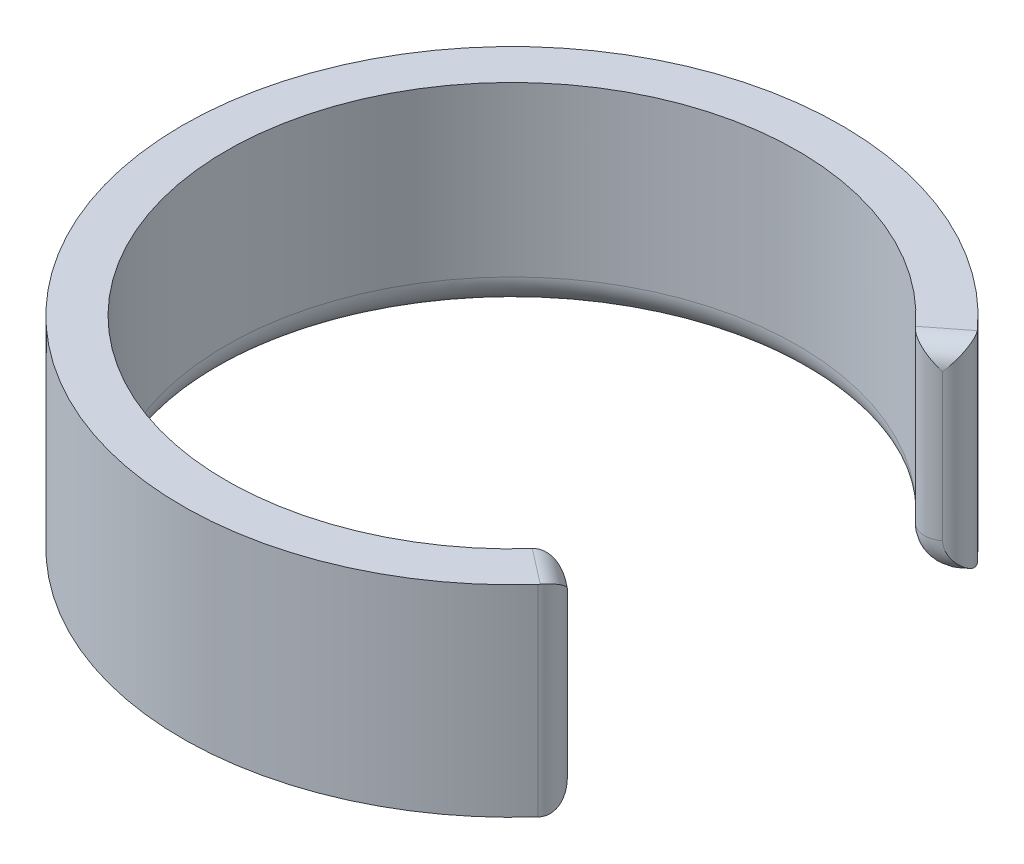
ISO-10303-21;
HEADER;
FILE_DESCRIPTION(('STEP AP214'),'2;1');
FILE_NAME('part.step','',(''),(''),'','','');
FILE_SCHEMA(('AUTOMOTIVE_DESIGN { 1 0 10303 214 1 1 1 1 }'));
ENDSEC;
DATA;
#1=APPLICATION_CONTEXT('core data for automotive mechanical design processes');
#2=APPLICATION_PROTOCOL_DEFINITION('international standard','automotive_design',2000,#1);
#3=PRODUCT_CONTEXT('',#1,'mechanical');
#4=PRODUCT('Part','Part','',(#3));
#5=PRODUCT_RELATED_PRODUCT_CATEGORY('part','',(#4));
#6=PRODUCT_DEFINITION_FORMATION('','',#4);
#7=PRODUCT_DEFINITION_CONTEXT('part definition',#1,'design');
#8=PRODUCT_DEFINITION('design','',#6,#7);
#9=PRODUCT_DEFINITION_SHAPE('','',#8);
#10=(LENGTH_UNIT() NAMED_UNIT(*) SI_UNIT(.MILLI.,.METRE.));
#11=(NAMED_UNIT(*) PLANE_ANGLE_UNIT() SI_UNIT($,.RADIAN.));
#12=(NAMED_UNIT(*) SI_UNIT($,.STERADIAN.) SOLID_ANGLE_UNIT());
#13=UNCERTAINTY_MEASURE_WITH_UNIT(LENGTH_MEASURE(1.E-05),#10,'distance_accuracy_value','');
#14=(GEOMETRIC_REPRESENTATION_CONTEXT(3) GLOBAL_UNCERTAINTY_ASSIGNED_CONTEXT((#13)) GLOBAL_UNIT_ASSIGNED_CONTEXT((#10,
#11,#12)) REPRESENTATION_CONTEXT('',''));
#15=CARTESIAN_POINT('',(0.,0.,0.));
#16=DIRECTION('',(0.,0.,1.));
#17=DIRECTION('',(1.,0.,0.));
#18=AXIS2_PLACEMENT_3D('',#15,#16,#17);
#19=CARTESIAN_POINT('',(0.,4.58329863327652,0.));
#20=DIRECTION('',(0.,-1.,0.));
#21=DIRECTION('',(0.,0.,-1.));
#22=AXIS2_PLACEMENT_3D('',#19,#20,#21);
#23=CYLINDRICAL_SURFACE('',#22,6.5);
#24=CARTESIAN_POINT('',(0.,4.58329863327652,0.));
#25=DIRECTION('',(0.,-1.,0.));
#26=DIRECTION('',(0.,0.,1.));
#27=AXIS2_PLACEMENT_3D('',#24,#25,#26);
#28=CIRCLE('',#27,6.5);
#29=CARTESIAN_POINT('',(4.82241417861219,4.58329863327652,4.35824752508621));
#30=VERTEX_POINT('',#29);
#31=CARTESIAN_POINT('',(4.80060237411817,4.58329863327652,-4.38226161309556));
#32=VERTEX_POINT('',#31);
#33=EDGE_CURVE('E226',#30,#32,#28,.T.);
#34=ORIENTED_EDGE('',*,*,#33,.F.);
#35=CARTESIAN_POINT('',(4.82241417861219,4.58329863327652,4.35824752508621));
#36=CARTESIAN_POINT('',(4.82642136161133,4.58329861032702,4.3538135336453));
#37=CARTESIAN_POINT('',(4.83041989299347,4.58319217041111,4.34937686898415));
#38=CARTESIAN_POINT('',(4.8383996525238,4.58276645664646,4.34049819322138));
#39=CARTESIAN_POINT('',(4.84238088067197,4.58244718279771,4.33605618211976));
#40=CARTESIAN_POINT('',(4.84635345720315,4.58202149198255,4.33161149779791));
#41=B_SPLINE_CURVE_WITH_KNOTS('',3,(#35,#36,#37,#38,#39,#40),.UNSPECIFIED.,.F.,.F.,(4,2,4),(0.,
0.0179207194014873,0.0358414388029743),.UNSPECIFIED.);
#42=CARTESIAN_POINT('',(4.84635345720315,4.58202149198255,4.3316114977979));
#43=VERTEX_POINT('',#42);
#44=EDGE_CURVE('E54',#30,#43,#41,.T.);
#45=ORIENTED_EDGE('',*,*,#44,.T.);
#46=DIRECTION('',(0.,-1.,0.));
#47=VECTOR('',#46,1.);
#48=CARTESIAN_POINT('',(4.84635345720315,4.58329863327652,4.3316114977979));
#49=LINE('',#48,#47);
#50=CARTESIAN_POINT('',(4.84635345720315,0.75,4.3316114977979));
#51=VERTEX_POINT('',#50);
#52=EDGE_CURVE('E162',#43,#51,#49,.T.);
#53=ORIENTED_EDGE('',*,*,#52,.T.);
#54=CARTESIAN_POINT('',(0.,0.75,0.));
#55=DIRECTION('',(0.,1.,0.));
#56=DIRECTION('',(0.,0.,1.));
#57=AXIS2_PLACEMENT_3D('',#54,#55,#56);
#58=CIRCLE('',#57,6.5);
#59=CARTESIAN_POINT('',(4.82467429330509,0.75,-4.35574539700394));
#60=VERTEX_POINT('',#59);
#61=EDGE_CURVE('E220',#51,#60,#58,.F.);
#62=ORIENTED_EDGE('',*,*,#61,.T.);
#63=DIRECTION('',(0.,-1.,0.));
#64=VECTOR('',#63,1.);
#65=CARTESIAN_POINT('',(4.82467429330509,4.58329863327652,-4.35574539700394));
#66=LINE('',#65,#64);
#67=CARTESIAN_POINT('',(4.82467429330509,4.58202149198255,-4.35574539700394));
#68=VERTEX_POINT('',#67);
#69=EDGE_CURVE('E188',#60,#68,#66,.F.);
#70=ORIENTED_EDGE('',*,*,#69,.T.);
#71=CARTESIAN_POINT('',(4.82467429330509,4.58202149198255,-4.35574539700394));
#72=CARTESIAN_POINT('',(4.82067958310865,4.58244718279771,-4.36017019908579));
#73=CARTESIAN_POINT('',(4.81667623474485,4.58276645664646,-4.36459228480102));
#74=CARTESIAN_POINT('',(4.80865226168255,4.58319217041111,-4.37343102349823));
#75=CARTESIAN_POINT('',(4.80463163698404,4.58329861032702,-4.37784767648021));
#76=CARTESIAN_POINT('',(4.80060237411817,4.58329863327652,-4.38226161309556));
#77=B_SPLINE_CURVE_WITH_KNOTS('',3,(#71,#72,#73,#74,#75,#76),.UNSPECIFIED.,.F.,.F.,(4,2,4),(0.,
0.017920719401488,0.0358414388029762),.UNSPECIFIED.);
#78=EDGE_CURVE('E150',#68,#32,#77,.T.);
#79=ORIENTED_EDGE('',*,*,#78,.T.);
#80=EDGE_LOOP('',(#34,#45,#53,#62,#70,#79));
#81=FACE_BOUND('',#80,.T.);
#82=ADVANCED_FACE('F35',(#81),#23,.F.);
#83=CARTESIAN_POINT('',(0.,4.58329863327652,0.));
#84=DIRECTION('',(0.,-1.,0.));
#85=DIRECTION('',(0.,0.,-1.));
#86=AXIS2_PLACEMENT_3D('',#83,#84,#85);
#87=CYLINDRICAL_SURFACE('',#86,7.50000000000001);
#88=CARTESIAN_POINT('',(0.,0.,0.));
#89=DIRECTION('',(0.,1.,0.));
#90=DIRECTION('',(0.,0.,1.));
#91=AXIS2_PLACEMENT_3D('',#88,#89,#90);
#92=CIRCLE('',#91,7.50000000000001);
#93=CARTESIAN_POINT('',(5.56693187689049,0.,-5.02586007346609));
#94=VERTEX_POINT('',#93);
#95=CARTESIAN_POINT('',(5.59194629677288,0.,4.9980132666899));
#96=VERTEX_POINT('',#95);
#97=EDGE_CURVE('E223',#94,#96,#92,.T.);
#98=ORIENTED_EDGE('',*,*,#97,.T.);
#99=DIRECTION('',(0.,-1.,0.));
#100=VECTOR('',#99,1.);
#101=CARTESIAN_POINT('',(5.59194629677288,4.58329863327652,4.9980132666899));
#102=LINE('',#101,#100);
#103=CARTESIAN_POINT('',(5.59194629677288,4.58329863327652,4.9980132666899));
#104=VERTEX_POINT('',#103);
#105=EDGE_CURVE('E201',#96,#104,#102,.F.);
#106=ORIENTED_EDGE('',*,*,#105,.T.);
#107=CARTESIAN_POINT('',(0.,4.58329863327652,0.));
#108=DIRECTION('',(0.,1.,0.));
#109=DIRECTION('',(0.,0.,1.));
#110=AXIS2_PLACEMENT_3D('',#107,#108,#109);
#111=CIRCLE('',#110,7.50000000000001);
#112=CARTESIAN_POINT('',(5.56693187689049,4.58329863327652,-5.02586007346609));
#113=VERTEX_POINT('',#112);
#114=EDGE_CURVE('E222',#113,#104,#111,.T.);
#115=ORIENTED_EDGE('',*,*,#114,.F.);
#116=DIRECTION('',(0.,-1.,0.));
#117=VECTOR('',#116,1.);
#118=CARTESIAN_POINT('',(5.56693187689049,4.58329863327652,-5.02586007346609));
#119=LINE('',#118,#117);
#120=EDGE_CURVE('E204',#113,#94,#119,.T.);
#121=ORIENTED_EDGE('',*,*,#120,.T.);
#122=EDGE_LOOP('',(#98,#106,#115,#121));
#123=FACE_BOUND('',#122,.T.);
#124=ADVANCED_FACE('F135',(#123),#87,.T.);
#125=CARTESIAN_POINT('',(0.,4.58329863327652,0.));
#126=DIRECTION('',(0.,1.,0.));
#127=DIRECTION('',(0.,0.,1.));
#128=AXIS2_PLACEMENT_3D('',#125,#126,#127);
#129=PLANE('',#128);
#130=ORIENTED_EDGE('',*,*,#114,.T.);
#131=CARTESIAN_POINT('',(5.21914987698802,4.58329863327652,4.6648123822439));
#132=DIRECTION('',(0.,1.,0.));
#133=DIRECTION('',(0.,0.,1.));
#134=AXIS2_PLACEMENT_3D('',#131,#132,#133);
#135=CIRCLE('',#134,0.5);
#136=CARTESIAN_POINT('',(5.61479413254369,4.58329863327652,4.97053386177355));
#137=VERTEX_POINT('',#136);
#138=EDGE_CURVE('E189',#104,#137,#135,.T.);
#139=ORIENTED_EDGE('',*,*,#138,.T.);
#140=DIRECTION('',(-0.791288511111343,0.,-0.6114429590593));
#141=VECTOR('',#140,1.);
#142=CARTESIAN_POINT('',(4.83765384269408,4.58329863327652,4.37002348944112));
#143=LINE('',#142,#141);
#144=EDGE_CURVE('E192',#137,#30,#143,.T.);
#145=ORIENTED_EDGE('',*,*,#144,.T.);
#146=ORIENTED_EDGE('',*,*,#33,.T.);
#147=DIRECTION('',(0.788226981996896,0.,-0.615384615384611));
#148=VECTOR('',#147,1.);
#149=CARTESIAN_POINT('',(5.60401005728441,4.58329863327652,-5.00949810638304));
#150=LINE('',#149,#148);
#151=CARTESIAN_POINT('',(5.58991657609624,4.58329863327652,-4.99849504292732));
#152=VERTEX_POINT('',#151);
#153=EDGE_CURVE('E186',#32,#152,#150,.T.);
#154=ORIENTED_EDGE('',*,*,#153,.T.);
#155=CARTESIAN_POINT('',(5.19580308509779,4.58329863327652,-4.69080273523502));
#156=DIRECTION('',(0.,1.,0.));
#157=DIRECTION('',(0.,0.,1.));
#158=AXIS2_PLACEMENT_3D('',#155,#156,#157);
#159=CIRCLE('',#158,0.5);
#160=EDGE_CURVE('E198',#152,#113,#159,.T.);
#161=ORIENTED_EDGE('',*,*,#160,.T.);
#162=EDGE_LOOP('',(#130,#139,#145,#146,#154,#161));
#163=FACE_BOUND('',#162,.T.);
#164=ADVANCED_FACE('F140',(#163),#129,.T.);
#165=CARTESIAN_POINT('',(0.,0.,0.));
#166=DIRECTION('',(0.,1.,0.));
#167=DIRECTION('',(0.,0.,1.));
#168=AXIS2_PLACEMENT_3D('',#165,#166,#167);
#169=PLANE('',#168);
#170=DIRECTION('',(-0.791288511111343,0.,-0.6114429590593));
#171=VECTOR('',#170,1.);
#172=CARTESIAN_POINT('',(-0.30572147952965,0.,0.395644255555671));
#173=LINE('',#172,#171);
#174=CARTESIAN_POINT('',(5.41746105972827,0.,4.81805102363267));
#175=VERTEX_POINT('',#174);
#176=CARTESIAN_POINT('',(5.61479413254369,0.,4.97053386177355));
#177=VERTEX_POINT('',#176);
#178=EDGE_CURVE('E210',#175,#177,#173,.F.);
#179=ORIENTED_EDGE('',*,*,#178,.T.);
#180=CARTESIAN_POINT('',(5.21914987698802,0.,4.6648123822439));
#181=DIRECTION('',(0.,1.,0.));
#182=DIRECTION('',(0.,0.,1.));
#183=AXIS2_PLACEMENT_3D('',#180,#181,#182);
#184=CIRCLE('',#183,0.5);
#185=EDGE_CURVE('E207',#177,#96,#184,.F.);
#186=ORIENTED_EDGE('',*,*,#185,.T.);
#187=ORIENTED_EDGE('',*,*,#97,.F.);
#188=CARTESIAN_POINT('',(5.19580308509779,0.,-4.69080273523502));
#189=DIRECTION('',(0.,1.,0.));
#190=DIRECTION('',(0.,0.,1.));
#191=AXIS2_PLACEMENT_3D('',#188,#189,#190);
#192=CIRCLE('',#191,0.5);
#193=CARTESIAN_POINT('',(5.58991657609624,0.,-4.99849504292733));
#194=VERTEX_POINT('',#193);
#195=EDGE_CURVE('E213',#94,#194,#192,.F.);
#196=ORIENTED_EDGE('',*,*,#195,.T.);
#197=DIRECTION('',(0.788226981996896,0.,-0.615384615384611));
#198=VECTOR('',#197,1.);
#199=CARTESIAN_POINT('',(-0.307692307692306,0.,-0.394113490998449));
#200=LINE('',#199,#198);
#201=CARTESIAN_POINT('',(5.39334699338485,0.,-4.84502922684132));
#202=VERTEX_POINT('',#201);
#203=EDGE_CURVE('E97',#194,#202,#200,.F.);
#204=ORIENTED_EDGE('',*,*,#203,.T.);
#205=CARTESIAN_POINT('',(0.,0.,0.));
#206=DIRECTION('',(0.,1.,0.));
#207=DIRECTION('',(0.,0.,1.));
#208=AXIS2_PLACEMENT_3D('',#205,#206,#207);
#209=CIRCLE('',#208,7.25);
#210=EDGE_CURVE('E217',#202,#175,#209,.T.);
#211=ORIENTED_EDGE('',*,*,#210,.T.);
#212=EDGE_LOOP('',(#179,#186,#187,#196,#204,#211));
#213=FACE_BOUND('',#212,.T.);
#214=ADVANCED_FACE('F271',(#213),#169,.F.);
#215=CARTESIAN_POINT('',(0.,0.75,0.));
#216=DIRECTION('',(0.,1.,0.));
#217=DIRECTION('',(0.,0.,1.));
#218=AXIS2_PLACEMENT_3D('',#215,#216,#217);
#219=TOROIDAL_SURFACE('',#218,7.25,0.75);
#220=ORIENTED_EDGE('',*,*,#61,.F.);
#221=CARTESIAN_POINT('',(5.53600769360679,0.832594427792671,4.27777337598383));
#222=CARTESIAN_POINT('',(5.18701085731549,0.987369571696137,4.00809720188573));
#223=CARTESIAN_POINT('',(4.87837768875826,0.997783283378013,4.35897680753872));
#224=CARTESIAN_POINT('',(5.53232048578502,0.819352583616808,4.27492420374191));
#225=CARTESIAN_POINT('',(5.17690650152885,0.949138734938201,4.0002893832269));
#226=CARTESIAN_POINT('',(4.86777385403062,0.95805775085172,4.34991697255128));
#227=CARTESIAN_POINT('',(5.52953604501313,0.80571397581641,4.2727726159443));
#228=CARTESIAN_POINT('',(5.16928811371845,0.909878346172948,3.99440251703254));
#229=CARTESIAN_POINT('',(4.85976676239197,0.917141927450681,4.34307477802982));
#230=CARTESIAN_POINT('',(5.52581250800537,0.778050143277551,4.26989537148262));
#231=CARTESIAN_POINT('',(5.15911418118897,0.830423859753835,3.9865409351648));
#232=CARTESIAN_POINT('',(4.84905951037332,0.834150429833606,4.33392457490062));
#233=CARTESIAN_POINT('',(5.52487204190942,0.764025213392329,4.26916865630284));
#234=CARTESIAN_POINT('',(5.15654835296601,0.79020570017693,3.98455827324181));
#235=CARTESIAN_POINT('',(4.846355410483,0.792075640177294,4.33161320041751));
#236=CARTESIAN_POINT('',(5.52487067080453,0.735968210191496,4.26916759682527));
#237=CARTESIAN_POINT('',(5.15654484504518,0.709775457961467,3.98455556260787));
#238=CARTESIAN_POINT('',(4.84635150300742,0.707904630574183,4.33160979437994));
#239=CARTESIAN_POINT('',(5.5258106473277,0.721936136609949,4.26989393370329));
#240=CARTESIAN_POINT('',(5.15910956839316,0.669537032434752,3.98653737077397));
#241=CARTESIAN_POINT('',(4.8490542300869,0.665808409829579,4.33391992934148));
#242=CARTESIAN_POINT('',(5.52954141655877,0.694273719785895,4.27277676663487));
#243=CARTESIAN_POINT('',(5.16930233122381,0.590085962038948,3.99441350315634));
#244=CARTESIAN_POINT('',(4.85978213822166,0.582821159357575,4.34308805137055));
#245=CARTESIAN_POINT('',(5.53233185019303,0.680643299140114,4.27493298522573));
#246=CARTESIAN_POINT('',(5.17693596216452,0.550848184956044,4.00031214799347));
#247=CARTESIAN_POINT('',(4.86780628667693,0.541929897420353,4.34994515611719));
#248=CARTESIAN_POINT('',(5.53968116825138,0.65417637586629,4.2806119363511));
#249=CARTESIAN_POINT('',(5.19709214743574,0.474388413197764,4.01588719728653));
#250=CARTESIAN_POINT('',(4.88894227846796,0.46252912759886,4.36800263882727));
#251=CARTESIAN_POINT('',(5.5442389119002,0.641339367285767,4.2841337873879));
#252=CARTESIAN_POINT('',(5.20962400729297,0.437144176525134,4.02557079229142));
#253=CARTESIAN_POINT('',(4.90205083988388,0.42401810185715,4.37920021507209));
#254=CARTESIAN_POINT('',(5.5549994133568,0.616795216515413,4.29244862168563));
#255=CARTESIAN_POINT('',(5.23932114806218,0.365535038897523,4.04851831063972));
#256=CARTESIAN_POINT('',(4.93300385570068,0.350385649546091,4.40563202699084));
#257=CARTESIAN_POINT('',(5.56120443001788,0.605089656141707,4.29724335040339));
#258=CARTESIAN_POINT('',(5.25650985635647,0.331159472839836,4.0618003367456));
#259=CARTESIAN_POINT('',(4.95085481322357,0.31526896842512,4.42087180558327));
#260=CARTESIAN_POINT('',(5.57508229295569,0.583153490149847,4.30796702635845));
#261=CARTESIAN_POINT('',(5.29513865688241,0.266227707147389,4.09164951029839));
#262=CARTESIAN_POINT('',(4.99078682070619,0.249460470449542,4.45494874361209));
#263=CARTESIAN_POINT('',(5.58275580896758,0.572923561267371,4.31389649111222));
#264=CARTESIAN_POINT('',(5.31660064914412,0.23566628099037,4.10823358029503));
#265=CARTESIAN_POINT('',(5.01286980076124,0.218770683801969,4.47378754443955));
#266=CARTESIAN_POINT('',(5.59934988894209,0.554231845044594,4.32671903714948));
#267=CARTESIAN_POINT('',(5.36328053691496,0.179214258628322,4.14430397472938));
#268=CARTESIAN_POINT('',(5.06063462895382,0.162695535133589,4.51451616636477));
#269=CARTESIAN_POINT('',(5.60827050389503,0.545770130036807,4.33361215783411));
#270=CARTESIAN_POINT('',(5.38851930621499,0.153325474276423,4.16380642872325));
#271=CARTESIAN_POINT('',(5.08631662424488,0.137310390110324,4.53640611221501));
#272=CARTESIAN_POINT('',(5.62713368193002,0.530831067166439,4.34818807702543));
#273=CARTESIAN_POINT('',(5.44223917284442,0.106906221070245,4.20531674228263));
#274=CARTESIAN_POINT('',(5.14063532798403,0.0924932014994182,4.5826805802313));
#275=CARTESIAN_POINT('',(5.63707901935786,0.52435930598695,4.35587301931934));
#276=CARTESIAN_POINT('',(5.47074827077646,0.0864013078614993,4.22734623842077));
#277=CARTESIAN_POINT('',(5.16928005862452,0.0730779179610511,4.60707187368988));
#278=CARTESIAN_POINT('',(5.65767379577864,0.513617200110404,4.37178697593448));
#279=CARTESIAN_POINT('',(5.53020968043054,0.0515103997279969,4.27329314622771));
#280=CARTESIAN_POINT('',(5.2286119617646,0.0408516003309857,4.65756615049189));
#281=CARTESIAN_POINT('',(5.66832268026699,0.509345144515716,4.38001556177998));
#282=CARTESIAN_POINT('',(5.56117579684785,0.0371375312192413,4.2972212250345));
#283=CARTESIAN_POINT('',(5.25929752589394,0.0280354335463926,4.68366778568991));
#284=CARTESIAN_POINT('',(5.69360374192568,0.502097895119295,4.3995506958451));
#285=CARTESIAN_POINT('',(5.63529722748123,0.0113779830268102,4.35449619647637));
#286=CARTESIAN_POINT('',(5.3321650925314,0.00629368535888773,4.74561541666685));
#287=CARTESIAN_POINT('',(5.70840116438088,0.500001681498107,4.41098493208815));
#288=CARTESIAN_POINT('',(5.67909239962285,0.00256863128784207,4.38833751891535));
#289=CARTESIAN_POINT('',(5.37482923085038,5.04449859231461E-06,4.78186019575604));
#290=CARTESIAN_POINT('',(5.73433486381588,0.499998731332685,4.43102437117923));
#291=CARTESIAN_POINT('',(5.75659819688151,-0.00194675055442048,4.44822765172359));
#292=CARTESIAN_POINT('',(5.44962613206429,-3.80599815710271E-06,4.84535645779284));
#293=CARTESIAN_POINT('',(5.74547805333009,0.501189769854145,4.43963491546776));
#294=CARTESIAN_POINT('',(5.79018273326888,-0.000308767826542214,4.47417903104854));
#295=CARTESIAN_POINT('',(5.48177281233184,0.00356930956400239,4.87263118036005));
#296=CARTESIAN_POINT('',(5.76749407822804,0.5059126629361,4.45664709651336));
#297=CARTESIAN_POINT('',(5.8570480526918,0.010151189558717,4.52584707398395));
#298=CARTESIAN_POINT('',(5.54530081510295,0.0177379888067341,4.92650357808407));
#299=CARTESIAN_POINT('',(5.77836568564399,0.509453655302025,4.46504778439748));
#300=CARTESIAN_POINT('',(5.89032053941969,0.0190282184499178,4.55155732688726));
#301=CARTESIAN_POINT('',(5.57667865210298,0.0283609659036047,4.95309818769945));
#302=CARTESIAN_POINT('',(5.78893013461587,0.514142763350958,4.47321112539067));
#303=CARTESIAN_POINT('',(5.92283795236719,0.031516730532861,4.57668412060963));
#304=CARTESIAN_POINT('',(5.6071770147109,0.0424282900528745,4.9789339960043));
#305=(BOUNDED_SURFACE() B_SPLINE_SURFACE(3,2,((#221,#222,#223),(#224,#225,#226),(#227,#228,
#229),(#230,#231,#232),(#233,#234,#235),(#236,#237,#238),(#239,#240,#241),(#242,#243,#244),
(#245,#246,#247),(#248,#249,#250),(#251,#252,#253),(#254,#255,#256),(#257,#258,#259),(#260,#261,
#262),(#263,#264,#265),(#266,#267,#268),(#269,#270,#271),(#272,#273,#274),(#275,#276,#277),
(#278,#279,#280),(#281,#282,#283),(#284,#285,#286),(#287,#288,#289),(#290,#291,#292),(#293,#294,
#295),(#296,#297,#298),(#299,#300,#301),(#302,#303,#304)),.UNSPECIFIED.,.F.,.F.,
.F.) B_SPLINE_SURFACE_WITH_KNOTS((4,2,2,2,2,2,2,2,2,2,2,2,2,4),(3,3),(0.,0.0420576451593982,
0.0840840344931116,0.12613012998165,0.168168068983986,0.210178918101683,0.252247675628137,
0.294335665278191,0.336425376289248,0.378632195049133,0.420806136208752,0.47675135590913,
0.51896118096121,0.561336108407602),(0.,1.),
.UNSPECIFIED.) GEOMETRIC_REPRESENTATION_ITEM() RATIONAL_B_SPLINE_SURFACE(((1.,0.730507646378207,
1.),(1.,0.730976588301668,1.),(1.,0.73133098142019,1.),(1.,0.731805079431906,1.),(1.,
0.731924958541758,1.),(1.,0.731925150926137,1.),(1.,0.731805351841995,1.),(1.,0.731330261901147,
1.),(1.,0.730975016731797,1.),(1.,0.730040577205153,1.),(1.,0.72946152731163,1.),(1.,
0.728096787399118,1.),(1.,0.727310813644372,1.),(1.,0.725556662274696,1.),(1.,0.724588401527841,
1.),(1.,0.722499637164317,1.),(1.,0.72137912732267,1.),(1.,0.719016118615658,1.),(1.,
0.717773289010064,1.),(1.,0.71520698774326,1.),(1.,0.713883579653455,1.),(1.,0.710751018061443,
1.),(1.,0.708924360304871,1.),(1.,0.705735445136556,1.),(1.,0.704369277078736,1.),(1.,
0.70167750416126,1.),(1.,0.700352078865073,1.),(1.,0.699067691446422,1.))) REPRESENTATION_ITEM('') SURFACE());
#306=CARTESIAN_POINT('',(4.87837768875826,0.997783283378013,4.35897680753872));
#307=CARTESIAN_POINT('',(4.86777385403062,0.95805775085172,4.34991697255128));
#308=CARTESIAN_POINT('',(4.85976676239197,0.917141927450681,4.34307477802982));
#309=CARTESIAN_POINT('',(4.84905951037332,0.834150429833606,4.33392457490062));
#310=CARTESIAN_POINT('',(4.846355410483,0.792075640177294,4.33161320041751));
#311=CARTESIAN_POINT('',(4.84635150300742,0.707904630574183,4.33160979437994));
#312=CARTESIAN_POINT('',(4.8490542300869,0.665808409829579,4.33391992934148));
#313=CARTESIAN_POINT('',(4.85978213822166,0.582821159357575,4.34308805137055));
#314=CARTESIAN_POINT('',(4.86780628667693,0.541929897420353,4.34994515611719));
#315=CARTESIAN_POINT('',(4.88894227846796,0.46252912759886,4.36800263882727));
#316=CARTESIAN_POINT('',(4.90205083988388,0.42401810185715,4.37920021507209));
#317=CARTESIAN_POINT('',(4.93300385570068,0.350385649546091,4.40563202699084));
#318=CARTESIAN_POINT('',(4.95085481322357,0.31526896842512,4.42087180558327));
#319=CARTESIAN_POINT('',(4.99078682070619,0.249460470449542,4.45494874361209));
#320=CARTESIAN_POINT('',(5.01286980076124,0.218770683801969,4.47378754443955));
#321=CARTESIAN_POINT('',(5.06063462895382,0.162695535133589,4.51451616636477));
#322=CARTESIAN_POINT('',(5.08631662424488,0.137310390110324,4.53640611221501));
#323=CARTESIAN_POINT('',(5.14063532798403,0.0924932014994182,4.5826805802313));
#324=CARTESIAN_POINT('',(5.16928005862452,0.0730779179610511,4.60707187368988));
#325=CARTESIAN_POINT('',(5.2286119617646,0.0408516003309857,4.65756615049189));
#326=CARTESIAN_POINT('',(5.25929752589394,0.0280354335463926,4.68366778568991));
#327=CARTESIAN_POINT('',(5.3321650925314,0.00629368535888773,4.74561541666685));
#328=CARTESIAN_POINT('',(5.37482923085038,5.04449859230529E-06,4.78186019575604));
#329=CARTESIAN_POINT('',(5.44962613206429,-3.80599815709568E-06,4.84535645779284));
#330=CARTESIAN_POINT('',(5.48177281233184,0.00356930956400241,4.87263118036005));
#331=CARTESIAN_POINT('',(5.54530081510295,0.0177379888067341,4.92650357808407));
#332=CARTESIAN_POINT('',(5.57667865210298,0.0283609659036047,4.95309818769945));
#333=CARTESIAN_POINT('',(5.6071770147109,0.0424282900528745,4.9789339960043));
#334=B_SPLINE_CURVE_WITH_KNOTS('',3,(#306,#307,#308,#309,#310,#311,#312,#313,#314,#315,#316,
#317,#318,#319,#320,#321,#322,#323,#324,#325,#326,#327,#328,#329,#330,#331,#332,#333),
.UNSPECIFIED.,.F.,.F.,(4,2,2,2,2,2,2,2,2,2,2,2,2,4),(0.,0.0420576451593982,0.0840840344931116,
0.12613012998165,0.168168068983986,0.210178918101683,0.252247675628137,0.294335665278191,
0.336425376289248,0.378632195049133,0.420806136208752,0.47675135590913,0.51896118096121,
0.561336108407602),.UNSPECIFIED.);
#335=EDGE_CURVE('E11',#51,#175,#334,.T.);
#336=ORIENTED_EDGE('',*,*,#335,.T.);
#337=ORIENTED_EDGE('',*,*,#210,.F.);
#338=CARTESIAN_POINT('',(5.76653251617508,0.514142763351059,-4.50204760255623));
#339=CARTESIAN_POINT('',(5.89992223884911,0.0315167305331295,-4.60618763462676));
#340=CARTESIAN_POINT('',(5.5822576285865,0.0424282900531763,-5.00685705597537));
#341=CARTESIAN_POINT('',(5.75603174625985,0.509459033434789,-4.4938494408552));
#342=CARTESIAN_POINT('',(5.86760033279413,0.0190407947784469,-4.58095327424525));
#343=CARTESIAN_POINT('',(5.5519543542751,0.0283771003044261,-4.98092571818586));
#344=CARTESIAN_POINT('',(5.74521694116516,0.505922906872869,-4.48540610559053));
#345=CARTESIAN_POINT('',(5.83450140636276,0.010175801613949,-4.55511227847014));
#346=CARTESIAN_POINT('',(5.52075217606452,0.017768720618672,-4.95421123389158));
#347=CARTESIAN_POINT('',(5.72328110661045,0.501194656571888,-4.46828035955683));
#348=CARTESIAN_POINT('',(5.76787870904513,-0.000299804342414886,-4.50309860233229));
#349=CARTESIAN_POINT('',(5.45747943428931,0.00358396971570586,-4.90001012095007));
#350=CARTESIAN_POINT('',(5.71216030315013,0.50000084762535,-4.45959812523029));
#351=CARTESIAN_POINT('',(5.73436140772867,-0.00194255722731136,-4.47693097289248));
#352=CARTESIAN_POINT('',(5.42540951188688,2.54287606154166E-06,-4.87252406187327));
#353=CARTESIAN_POINT('',(5.68991093342146,0.499999151813257,-4.44222759599728));
#354=CARTESIAN_POINT('',(5.66782438561432,0.00193630837214516,-4.42498418510434));
#355=CARTESIAN_POINT('',(5.36126323946441,-2.54456024149887E-06,-4.81751618162648));
#356=CARTESIAN_POINT('',(5.67878236688995,0.50119284569826,-4.43353930088534));
#357=CARTESIAN_POINT('',(5.63480367271131,0.00743488215905903,-4.39920425219965));
#358=CARTESIAN_POINT('',(5.32918689925501,0.00357853709477222,-4.78999434882779));
#359=CARTESIAN_POINT('',(5.65684302171026,0.505931613747727,-4.41641081403631));
#360=CARTESIAN_POINT('',(5.57020224490286,0.0252738203780769,-4.34876862171098));
#361=CARTESIAN_POINT('',(5.26596568618072,0.0177948412431864,-4.73572052526947));
#362=CARTESIAN_POINT('',(5.64603218456585,0.509476252218432,-4.40797057663001));
#363=CARTESIAN_POINT('',(5.53861299013912,0.0375875899689182,-4.32410625688832));
#364=CARTESIAN_POINT('',(5.23482064183898,0.0284287566553119,-4.70896839282184));
#365=CARTESIAN_POINT('',(5.62503873427426,0.518815544133729,-4.39158056889321));
#366=CARTESIAN_POINT('',(5.47771786638835,0.0685627464756072,-4.27656421231985));
#367=CARTESIAN_POINT('',(5.17435465379023,0.0564466324011738,-4.65700395121795));
#368=CARTESIAN_POINT('',(5.61485578105028,0.524608966955291,-4.38363053305792));
#369=CARTESIAN_POINT('',(5.44839659170411,0.0872004743140637,-4.25367250503721));
#370=CARTESIAN_POINT('',(5.14503272256871,0.0738269008658217,-4.63179080858423));
#371=CARTESIAN_POINT('',(5.59538796877578,0.538292579479316,-4.36843162152285));
#372=CARTESIAN_POINT('',(5.39271876924373,0.130223781293974,-4.21020371223666));
#373=CARTESIAN_POINT('',(5.08898715385565,0.114877738437932,-4.58357556974557));
#374=CARTESIAN_POINT('',(5.58610435701283,0.546185625903643,-4.3611837196055));
#375=CARTESIAN_POINT('',(5.3663476451158,0.154604316692796,-4.18961524666851));
#376=CARTESIAN_POINT('',(5.06226712465686,0.138556877710985,-4.56057654454552));
#377=CARTESIAN_POINT('',(5.56873184155184,0.563827179984417,-4.34762064832096));
#378=CARTESIAN_POINT('',(5.31729660529195,0.208304778101813,-4.15132011599468));
#379=CARTESIAN_POINT('',(5.01227535013898,0.191481539953195,-4.51752822818208));
#380=CARTESIAN_POINT('',(5.56064093923333,0.573572519532657,-4.34130391859068));
#381=CARTESIAN_POINT('',(5.29458993844561,0.237611704693866,-4.13359256572927));
#382=CARTESIAN_POINT('',(4.98899783598876,0.220717558597731,-4.49747400264859));
#383=CARTESIAN_POINT('',(5.54586713764681,0.594651387521189,-4.32976971535387));
#384=CARTESIAN_POINT('',(5.2533404891669,0.300354156272364,-4.10138829328112));
#385=CARTESIAN_POINT('',(4.9465005151641,0.28395416256334,-4.46084833696365));
#386=CARTESIAN_POINT('',(5.53918423695032,0.605984914350184,-4.32455224073209));
#387=CARTESIAN_POINT('',(5.23477708008277,0.333794113948758,-4.08689546745762));
#388=CARTESIAN_POINT('',(4.92728070437297,0.317954743050523,-4.44427689327878));
#389=CARTESIAN_POINT('',(5.52743054960932,0.62989739169692,-4.3153759012653));
#390=CARTESIAN_POINT('',(5.20226142597061,0.403833637950257,-4.0615098440816));
#391=CARTESIAN_POINT('',(4.89348168129829,0.389692175090793,-4.41512718560491));
#392=CARTESIAN_POINT('',(5.52235671367045,0.642473926547222,-4.311414655775));
#393=CARTESIAN_POINT('',(5.18828223371018,0.440439579795598,-4.05059600828423));
#394=CARTESIAN_POINT('',(4.87889369131499,0.427421779641569,-4.40254136862995));
#395=CARTESIAN_POINT('',(5.51395363981025,0.668514082008478,-4.30485420746048));
#396=CARTESIAN_POINT('',(5.16519807603805,0.515858468021422,-4.03257374335928));
#397=CARTESIAN_POINT('',(4.85473567819526,0.505542246025301,-4.3816952016356));
#398=CARTESIAN_POINT('',(5.51062291500776,0.681976935512225,-4.3022538437983));
#399=CARTESIAN_POINT('',(5.15607488732873,0.554688924068139,-4.02545108693772));
#400=CARTESIAN_POINT('',(4.84516137835569,0.545930806536639,-4.37343116512362));
#401=CARTESIAN_POINT('',(5.50508252440319,0.713509746201201,-4.29792834972217));
#402=CARTESIAN_POINT('',(5.14092627264368,0.645365232492756,-4.01362425959675));
#403=CARTESIAN_POINT('',(4.82923585628754,0.640529238603652,-4.35968404421148));
#404=CARTESIAN_POINT('',(5.50349648543236,0.731763878862982,-4.2966900972843));
#405=CARTESIAN_POINT('',(5.13659870128861,0.697722927987173,-4.01024563783587));
#406=CARTESIAN_POINT('',(4.82467743657102,0.69529163658894,-4.35574810551439));
#407=CARTESIAN_POINT('',(5.50349455341934,0.764009013552783,-4.29668858892299));
#408=CARTESIAN_POINT('',(5.13659339429461,0.790159305811187,-4.0102414945592));
#409=CARTESIAN_POINT('',(4.82467187864375,0.792027040658354,-4.35574331632255));
#410=CARTESIAN_POINT('',(5.50442904376894,0.778007397903831,-4.29741816428326));
#411=CARTESIAN_POINT('',(5.13914286838541,0.830301275216357,-4.01223192012016));
#412=CARTESIAN_POINT('',(4.82735768463086,0.834022193711543,-4.35806236603079));
#413=CARTESIAN_POINT('',(5.50813365231447,0.805665565295511,-4.30031042648312));
#414=CARTESIAN_POINT('',(5.14926494785042,0.909739079530437,-4.0201344305908));
#415=CARTESIAN_POINT('',(4.83800612016044,0.916996695886622,-4.36725469187141));
#416=CARTESIAN_POINT('',(5.51091116136816,0.819323754338449,-4.30247888351361));
#417=CARTESIAN_POINT('',(5.15686429338012,0.949055655812052,-4.02606739207623));
#418=CARTESIAN_POINT('',(4.84598999598585,0.957971263015435,-4.37414630484858));
#419=CARTESIAN_POINT('',(5.51458864291436,0.832594427792453,-4.30534996712097));
#420=CARTESIAN_POINT('',(5.16694209031866,0.987369571695507,-4.03393533029022));
#421=CARTESIAN_POINT('',(4.85656154744597,0.997783283377358,-4.38327019686227));
#422=(BOUNDED_SURFACE() B_SPLINE_SURFACE(3,2,((#338,#339,#340),(#341,#342,#343),(#344,#345,
#346),(#347,#348,#349),(#350,#351,#352),(#353,#354,#355),(#356,#357,#358),(#359,#360,#361),
(#362,#363,#364),(#365,#366,#367),(#368,#369,#370),(#371,#372,#373),(#374,#375,#376),(#377,#378,
#379),(#380,#381,#382),(#383,#384,#385),(#386,#387,#388),(#389,#390,#391),(#392,#393,#394),
(#395,#396,#397),(#398,#399,#400),(#401,#402,#403),(#404,#405,#406),(#407,#408,#409),(#410,#411,
#412),(#413,#414,#415),(#416,#417,#418),(#419,#420,#421)),.UNSPECIFIED.,.F.,.F.,
.F.) B_SPLINE_SURFACE_WITH_KNOTS((4,2,2,2,2,2,2,2,2,2,2,2,2,4),(3,3),(0.,0.042307601815434,
0.0845847537600676,0.126889906406225,0.169187220950813,0.211461421304192,0.25379343624176,
0.296053688866823,0.338313898617025,0.380493536892336,0.422637136872187,0.477254814346233,
0.519212189943208,0.561338847806958),(0.,1.),
.UNSPECIFIED.) GEOMETRIC_REPRESENTATION_ITEM() RATIONAL_B_SPLINE_SURFACE(((1.,0.699067691446394,
1.),(1.,0.700349271986227,1.),(1.,0.701672898437044,1.),(1.,0.704365279370643,1.),(1.,
0.705734000687972,1.),(1.,0.708480470895304,1.),(1.,0.709858225163983,1.),(1.,0.712582221503428,
1.),(1.,0.713928469365333,1.),(1.,0.716549927229259,1.),(1.,0.717825175649275,1.),(1.,
0.720269367215535,1.),(1.,0.721438162592545,1.),(1.,0.72363022247925,1.),(1.,0.724653730337714,
1.),(1.,0.726526099987055,1.),(1.,0.727374961955117,1.),(1.,0.728870033981886,1.),(1.,
0.729516627322316,1.),(1.,0.730588495554607,1.),(1.,0.731013959069002,1.),(1.,0.731721959333052,
1.),(1.,0.731924916359461,1.),(1.,0.731925160993558,1.),(1.,0.731805577207611,1.),(1.,
0.731332048501171,1.),(1.,0.730977159968048,1.),(1.,0.730507646378216,1.))) REPRESENTATION_ITEM('') SURFACE());
#423=CARTESIAN_POINT('',(5.5822576285865,0.0424282900531763,-5.00685705597537));
#424=CARTESIAN_POINT('',(5.5519543542751,0.0283771003044261,-4.98092571818586));
#425=CARTESIAN_POINT('',(5.52075217606452,0.017768720618672,-4.95421123389158));
#426=CARTESIAN_POINT('',(5.45747943428931,0.00358396971570586,-4.90001012095007));
#427=CARTESIAN_POINT('',(5.42540951188688,2.54287606154479E-06,-4.87252406187327));
#428=CARTESIAN_POINT('',(5.36126323946441,-2.544560241502E-06,-4.81751618162648));
#429=CARTESIAN_POINT('',(5.32918689925501,0.00357853709477221,-4.78999434882779));
#430=CARTESIAN_POINT('',(5.26596568618072,0.0177948412431864,-4.73572052526947));
#431=CARTESIAN_POINT('',(5.23482064183898,0.0284287566553119,-4.70896839282184));
#432=CARTESIAN_POINT('',(5.17435465379023,0.0564466324011738,-4.65700395121795));
#433=CARTESIAN_POINT('',(5.14503272256871,0.0738269008658218,-4.63179080858423));
#434=CARTESIAN_POINT('',(5.08898715385565,0.114877738437931,-4.58357556974557));
#435=CARTESIAN_POINT('',(5.06226712465686,0.138556877710985,-4.56057654454552));
#436=CARTESIAN_POINT('',(5.01227535013898,0.191481539953195,-4.51752822818208));
#437=CARTESIAN_POINT('',(4.98899783598876,0.220717558597731,-4.49747400264859));
#438=CARTESIAN_POINT('',(4.9465005151641,0.28395416256334,-4.46084833696365));
#439=CARTESIAN_POINT('',(4.92728070437297,0.317954743050523,-4.44427689327878));
#440=CARTESIAN_POINT('',(4.89348168129829,0.389692175090793,-4.41512718560491));
#441=CARTESIAN_POINT('',(4.87889369131499,0.427421779641569,-4.40254136862995));
#442=CARTESIAN_POINT('',(4.85473567819526,0.505542246025301,-4.38169520163561));
#443=CARTESIAN_POINT('',(4.84516137835569,0.545930806536639,-4.37343116512362));
#444=CARTESIAN_POINT('',(4.82923585628754,0.640529238603652,-4.35968404421148));
#445=CARTESIAN_POINT('',(4.82467743657102,0.69529163658894,-4.35574810551439));
#446=CARTESIAN_POINT('',(4.82467187864375,0.792027040658354,-4.35574331632255));
#447=CARTESIAN_POINT('',(4.82735768463086,0.834022193711543,-4.35806236603079));
#448=CARTESIAN_POINT('',(4.83800612016044,0.916996695886622,-4.36725469187141));
#449=CARTESIAN_POINT('',(4.84598999598585,0.957971263015435,-4.37414630484858));
#450=CARTESIAN_POINT('',(4.85656154744597,0.997783283377358,-4.38327019686227));
#451=B_SPLINE_CURVE_WITH_KNOTS('',3,(#423,#424,#425,#426,#427,#428,#429,#430,#431,#432,#433,
#434,#435,#436,#437,#438,#439,#440,#441,#442,#443,#444,#445,#446,#447,#448,#449,#450),
.UNSPECIFIED.,.F.,.F.,(4,2,2,2,2,2,2,2,2,2,2,2,2,4),(0.,0.042307601815434,0.0845847537600676,
0.126889906406225,0.169187220950813,0.211461421304192,0.25379343624176,0.296053688866823,
0.338313898617025,0.380493536892336,0.422637136872187,0.477254814346233,0.519212189943208,
0.561338847806958),.UNSPECIFIED.);
#452=EDGE_CURVE('E45',#202,#60,#451,.T.);
#453=ORIENTED_EDGE('',*,*,#452,.T.);
#454=EDGE_LOOP('',(#220,#336,#337,#453));
#455=FACE_BOUND('',#454,.T.);
#456=ADVANCED_FACE('F145',(#455),#219,.T.);
#457=CARTESIAN_POINT('',(-0.30572147952965,4.08329863327652,0.395644255555671));
#458=DIRECTION('',(0.791288511111343,0.,0.6114429590593));
#459=DIRECTION('',(0.6114429590593,0.,-0.791288511111343));
#460=AXIS2_PLACEMENT_3D('',#457,#458,#459);
#461=CYLINDRICAL_SURFACE('',#460,0.5);
#462=CARTESIAN_POINT('',(5.21914987698801,4.08329863327652,4.6648123822439));
#463=DIRECTION('',(-0.559525472081838,-0.707106781186547,-0.4323554626596));
#464=DIRECTION('',(0.559525472081838,-0.707106781186547,0.4323554626596));
#465=AXIS2_PLACEMENT_3D('',#462,#463,#464);
#466=ELLIPSE('',#465,0.707106781186547,0.5);
#467=CARTESIAN_POINT('',(5.52487135651767,4.08329863327652,4.26916812668823));
#468=VERTEX_POINT('',#467);
#469=EDGE_CURVE('E227',#43,#468,#466,.T.);
#470=ORIENTED_EDGE('',*,*,#469,.F.);
#471=ORIENTED_EDGE('',*,*,#44,.F.);
#472=ORIENTED_EDGE('',*,*,#144,.F.);
#473=CARTESIAN_POINT('',(5.21914987698802,4.08329863327652,4.6648123822439));
#474=DIRECTION('',(0.559525472081838,-0.707106781186547,0.4323554626596));
#475=DIRECTION('',(0.559525472081838,0.707106781186547,0.4323554626596));
#476=AXIS2_PLACEMENT_3D('',#473,#474,#475);
#477=ELLIPSE('',#476,0.707106781186547,0.5);
#478=EDGE_CURVE('E241',#468,#137,#477,.T.);
#479=ORIENTED_EDGE('',*,*,#478,.F.);
#480=EDGE_LOOP('',(#470,#471,#472,#479));
#481=FACE_BOUND('',#480,.T.);
#482=ADVANCED_FACE('F166',(#481),#461,.T.);
#483=CARTESIAN_POINT('',(5.21914987698801,4.58329863327652,4.6648123822439));
#484=DIRECTION('',(0.,-1.,0.));
#485=DIRECTION('',(0.,0.,-1.));
#486=AXIS2_PLACEMENT_3D('',#483,#484,#485);
#487=CYLINDRICAL_SURFACE('',#486,0.5);
#488=CARTESIAN_POINT('',(5.21914987698801,0.75,4.6648123822439));
#489=DIRECTION('',(0.,-1.,0.));
#490=DIRECTION('',(0.,0.,-1.));
#491=AXIS2_PLACEMENT_3D('',#488,#489,#490);
#492=CIRCLE('',#491,0.5);
#493=CARTESIAN_POINT('',(5.52487135651767,0.75,4.26916812668823));
#494=VERTEX_POINT('',#493);
#495=EDGE_CURVE('E245',#51,#494,#492,.T.);
#496=ORIENTED_EDGE('',*,*,#495,.F.);
#497=ORIENTED_EDGE('',*,*,#52,.F.);
#498=ORIENTED_EDGE('',*,*,#469,.T.);
#499=DIRECTION('',(0.,-1.,0.));
#500=VECTOR('',#499,1.);
#501=CARTESIAN_POINT('',(5.52487135651766,4.58329863327652,4.26916812668823));
#502=LINE('',#501,#500);
#503=EDGE_CURVE('E281',#494,#468,#502,.F.);
#504=ORIENTED_EDGE('',*,*,#503,.F.);
#505=EDGE_LOOP('',(#496,#497,#498,#504));
#506=FACE_BOUND('',#505,.T.);
#507=ADVANCED_FACE('F170',(#506),#487,.T.);
#508=CARTESIAN_POINT('',(5.41746105972827,0.5,4.81805102363267));
#509=DIRECTION('',(0.791288511111343,0.,0.611442959059301));
#510=DIRECTION('',(0.611442959059301,0.,-0.791288511111343));
#511=AXIS2_PLACEMENT_3D('',#508,#509,#510);
#512=CIRCLE('',#511,0.5);
#513=CARTESIAN_POINT('',(5.68200508599067,0.249381951139762,4.4756958692179));
#514=VERTEX_POINT('',#513);
#515=EDGE_CURVE('E282',#175,#514,#512,.T.);
#516=ORIENTED_EDGE('',*,*,#515,.F.);
#517=ORIENTED_EDGE('',*,*,#335,.F.);
#518=ORIENTED_EDGE('',*,*,#495,.T.);
#519=CARTESIAN_POINT('',(5.52487135651767,0.75,4.26916812668823));
#520=CARTESIAN_POINT('',(5.52487094722106,0.742553239878467,4.26916812219284));
#521=CARTESIAN_POINT('',(5.52500340306843,0.735106742754508,4.26927011149752));
#522=CARTESIAN_POINT('',(5.52543648315415,0.722877741210153,4.26960536181303));
#523=CARTESIAN_POINT('',(5.52566043621413,0.718090758556018,4.26977895171301));
#524=CARTESIAN_POINT('',(5.52612661253876,0.710065332327017,4.27014121062872));
#525=CARTESIAN_POINT('',(5.52633978348632,0.706824111045136,4.27030706552267));
#526=CARTESIAN_POINT('',(5.52752880532456,0.690623013288175,4.27123402828961));
#527=CARTESIAN_POINT('',(5.5288727354138,0.677704951297468,4.27228709972183));
#528=CARTESIAN_POINT('',(5.53405425066807,0.638920894643662,4.27641080119662));
#529=CARTESIAN_POINT('',(5.53903692038477,0.613299740567703,4.28044360992367));
#530=CARTESIAN_POINT('',(5.55137135085936,0.563135172105687,4.2910555211178));
#531=CARTESIAN_POINT('',(5.55872985700368,0.538595055140866,4.29764188436314));
#532=CARTESIAN_POINT('',(5.57876645074967,0.47975141870271,4.31703454102285));
#533=CARTESIAN_POINT('',(5.59232537242989,0.446228440375471,4.33130906132284));
#534=CARTESIAN_POINT('',(5.62013825938093,0.382445910779816,4.36533048052424));
#535=CARTESIAN_POINT('',(5.63439180142303,0.352184407536276,4.38507408066254));
#536=CARTESIAN_POINT('',(5.65400932903115,0.31052235670354,4.41774498543042));
#537=CARTESIAN_POINT('',(5.66001617292152,0.297763632177978,4.42859324824624));
#538=CARTESIAN_POINT('',(5.67147430418598,0.273005958160984,4.45135348376026));
#539=CARTESIAN_POINT('',(5.67692640313528,0.261005908780832,4.46326385329282));
#540=CARTESIAN_POINT('',(5.68200508599056,0.249381951139499,4.47569586921763));
#541=B_SPLINE_CURVE_WITH_KNOTS('',3,(#519,#520,#521,#522,#523,#524,#525,#526,#527,#528,#529,
#530,#531,#532,#533,#534,#535,#536,#537,#538,#539,#540),.UNSPECIFIED.,.F.,.F.,(4,2,2,2,2,2,2,2,
2,2,4),(0.,0.0223377002729067,0.0367217915179573,0.0464787251971595,0.0855333016583964,
0.164457838195702,0.243608454396333,0.35965082290147,0.475623350430192,0.528949872191474,
0.582197221896605),.UNSPECIFIED.);
#542=EDGE_CURVE('E285',#514,#494,#541,.F.);
#543=ORIENTED_EDGE('',*,*,#542,.F.);
#544=EDGE_LOOP('',(#516,#517,#518,#543));
#545=FACE_BOUND('',#544,.T.);
#546=ADVANCED_FACE('F293',(#545),#305,.T.);
#547=CARTESIAN_POINT('',(4.83765384269408,0.5,4.37002348944112));
#548=DIRECTION('',(-0.791288511111343,0.,-0.6114429590593));
#549=DIRECTION('',(-0.6114429590593,0.,0.791288511111343));
#550=AXIS2_PLACEMENT_3D('',#547,#548,#549);
#551=CYLINDRICAL_SURFACE('',#550,0.5);
#552=ORIENTED_EDGE('',*,*,#178,.F.);
#553=ORIENTED_EDGE('',*,*,#515,.T.);
#554=CARTESIAN_POINT('',(5.21914987698802,0.5,4.6648123822439));
#555=DIRECTION('',(-0.559525472081838,-0.707106781186547,-0.4323554626596));
#556=DIRECTION('',(-0.559525472081838,0.707106781186547,-0.4323554626596));
#557=AXIS2_PLACEMENT_3D('',#554,#555,#556);
#558=ELLIPSE('',#557,0.707106781186547,0.5);
#559=EDGE_CURVE('E92',#177,#514,#558,.F.);
#560=ORIENTED_EDGE('',*,*,#559,.F.);
#561=EDGE_LOOP('',(#552,#553,#560));
#562=FACE_BOUND('',#561,.T.);
#563=ADVANCED_FACE('F314',(#562),#551,.T.);
#564=CARTESIAN_POINT('',(5.21914987698802,4.58329863327652,4.6648123822439));
#565=DIRECTION('',(0.,-1.,0.));
#566=DIRECTION('',(0.,0.,-1.));
#567=AXIS2_PLACEMENT_3D('',#564,#565,#566);
#568=CYLINDRICAL_SURFACE('',#567,0.5);
#569=ORIENTED_EDGE('',*,*,#138,.F.);
#570=ORIENTED_EDGE('',*,*,#105,.F.);
#571=ORIENTED_EDGE('',*,*,#185,.F.);
#572=ORIENTED_EDGE('',*,*,#559,.T.);
#573=ORIENTED_EDGE('',*,*,#542,.T.);
#574=ORIENTED_EDGE('',*,*,#503,.T.);
#575=ORIENTED_EDGE('',*,*,#478,.T.);
#576=EDGE_LOOP('',(#569,#570,#571,#572,#573,#574,#575));
#577=FACE_BOUND('',#576,.T.);
#578=ADVANCED_FACE('F278',(#577),#568,.T.);
#579=CARTESIAN_POINT('',(4.81578307528751,0.5,-4.39411349099842));
#580=DIRECTION('',(0.788226981996896,0.,-0.615384615384611));
#581=DIRECTION('',(-0.615384615384611,0.,-0.788226981996896));
#582=AXIS2_PLACEMENT_3D('',#579,#580,#581);
#583=CYLINDRICAL_SURFACE('',#582,0.5);
#584=CARTESIAN_POINT('',(5.39334699338485,0.5,-4.84502922684132));
#585=DIRECTION('',(-0.788226981996896,0.,0.615384615384611));
#586=DIRECTION('',(0.615384615384611,0.,0.788226981996896));
#587=AXIS2_PLACEMENT_3D('',#584,#585,#586);
#588=CIRCLE('',#587,0.5);
#589=CARTESIAN_POINT('',(5.6595963980787,0.249381951139762,-4.50399865917082));
#590=VERTEX_POINT('',#589);
#591=EDGE_CURVE('E39',#202,#590,#588,.T.);
#592=ORIENTED_EDGE('',*,*,#591,.F.);
#593=ORIENTED_EDGE('',*,*,#203,.F.);
#594=CARTESIAN_POINT('',(5.19580308509779,0.5,-4.69080273523502));
#595=DIRECTION('',(0.557360644084212,0.707106781186547,-0.435142634576334));
#596=DIRECTION('',(0.557360644084212,-0.707106781186547,-0.435142634576334));
#597=AXIS2_PLACEMENT_3D('',#594,#595,#596);
#598=ELLIPSE('',#597,0.707106781186547,0.5);
#599=EDGE_CURVE('E94',#590,#194,#598,.T.);
#600=ORIENTED_EDGE('',*,*,#599,.F.);
#601=EDGE_LOOP('',(#592,#593,#600));
#602=FACE_BOUND('',#601,.T.);
#603=ADVANCED_FACE('F37',(#602),#583,.T.);
#604=CARTESIAN_POINT('',(5.19580308509779,0.75,-4.69080273523501));
#605=DIRECTION('',(0.,1.,0.));
#606=DIRECTION('',(0.,0.,1.));
#607=AXIS2_PLACEMENT_3D('',#604,#605,#606);
#608=CIRCLE('',#607,0.5);
#609=CARTESIAN_POINT('',(5.5034953927901,0.75,-4.29668924423657));
#610=VERTEX_POINT('',#609);
#611=EDGE_CURVE('E78',#60,#610,#608,.T.);
#612=ORIENTED_EDGE('',*,*,#611,.F.);
#613=ORIENTED_EDGE('',*,*,#452,.F.);
#614=ORIENTED_EDGE('',*,*,#591,.T.);
#615=CARTESIAN_POINT('',(5.6595963980787,0.249381951139762,-4.50399865917082));
#616=CARTESIAN_POINT('',(5.65356514951569,0.263356400945374,-4.48902098540158));
#617=CARTESIAN_POINT('',(5.64699261846927,0.277868410634003,-4.4748012847265));
#618=CARTESIAN_POINT('',(5.63311432176273,0.307951979282336,-4.44792905918904));
#619=CARTESIAN_POINT('',(5.62580865830419,0.323523390460075,-4.43527631643438));
#620=CARTESIAN_POINT('',(5.60334472683308,0.371741342920953,-4.39978951688231));
#621=CARTESIAN_POINT('',(5.58761105348294,0.405950842434855,-4.37936312746458));
#622=CARTESIAN_POINT('',(5.56478384871418,0.461333965235011,-4.35316052121144));
#623=CARTESIAN_POINT('',(5.55707573222854,0.481168977239193,-4.34498944469982));
#624=CARTESIAN_POINT('',(5.54268202419086,0.521845833665811,-4.33055559355852));
#625=CARTESIAN_POINT('',(5.53599457518794,0.542685756080374,-4.3242893313469));
#626=CARTESIAN_POINT('',(5.52359358777495,0.587352235923428,-4.31313818226813));
#627=CARTESIAN_POINT('',(5.51803714009246,0.611272553704656,-4.30844590409582));
#628=CARTESIAN_POINT('',(5.51108332887635,0.650539652890582,-4.30271784303438));
#629=CARTESIAN_POINT('',(5.5089082382853,0.665648824801351,-4.30096985657468));
#630=CARTESIAN_POINT('',(5.50623065594016,0.690337485108679,-4.29883792809068));
#631=CARTESIAN_POINT('',(5.50540677079984,0.699859770173871,-4.29818822623251));
#632=CARTESIAN_POINT('',(5.50440693614551,0.715484232170764,-4.29740228589209));
#633=CARTESIAN_POINT('',(5.50410435393233,0.721573545236548,-4.29716527530901));
#634=CARTESIAN_POINT('',(5.50362691102931,0.735106698813618,-4.29679189155734));
#635=CARTESIAN_POINT('',(5.50349495229567,0.74255300730314,-4.29668925424208));
#636=CARTESIAN_POINT('',(5.50349539278969,0.749999999999768,-4.29668924423625));
#637=B_SPLINE_CURVE_WITH_KNOTS('',3,(#615,#616,#617,#618,#619,#620,#621,#622,#623,#624,#625,
#626,#627,#628,#629,#630,#631,#632,#633,#634,#635,#636),.UNSPECIFIED.,.F.,.F.,(4,2,2,2,2,2,2,2,
2,2,4),(0.,0.0639877961828104,0.127966684571646,0.255653777476648,0.323943637374999,
0.392107699568441,0.466874644627907,0.512910849389084,0.541635152084583,0.559935649293409,
0.582273349566379),.UNSPECIFIED.);
#638=EDGE_CURVE('E87',#610,#590,#637,.F.);
#639=ORIENTED_EDGE('',*,*,#638,.F.);
#640=EDGE_LOOP('',(#612,#613,#614,#639));
#641=FACE_BOUND('',#640,.T.);
#642=ADVANCED_FACE('F85',(#641),#422,.T.);
#643=CARTESIAN_POINT('',(5.19580308509779,4.58329863327652,-4.69080273523501));
#644=DIRECTION('',(0.,-1.,0.));
#645=DIRECTION('',(0.,0.,-1.));
#646=AXIS2_PLACEMENT_3D('',#643,#644,#645);
#647=CYLINDRICAL_SURFACE('',#646,0.5);
#648=ORIENTED_EDGE('',*,*,#69,.F.);
#649=ORIENTED_EDGE('',*,*,#611,.T.);
#650=DIRECTION('',(0.,-1.,0.));
#651=VECTOR('',#650,1.);
#652=CARTESIAN_POINT('',(5.50349539279009,4.58329863327652,-4.29668924423657));
#653=LINE('',#652,#651);
#654=CARTESIAN_POINT('',(5.50349539279009,4.08329863327652,-4.29668924423657));
#655=VERTEX_POINT('',#654);
#656=EDGE_CURVE('E104',#655,#610,#653,.T.);
#657=ORIENTED_EDGE('',*,*,#656,.F.);
#658=CARTESIAN_POINT('',(5.19580308509779,4.08329863327652,-4.69080273523501));
#659=DIRECTION('',(-0.557360644084212,-0.707106781186547,0.435142634576334));
#660=DIRECTION('',(0.557360644084212,-0.707106781186547,-0.435142634576334));
#661=AXIS2_PLACEMENT_3D('',#658,#659,#660);
#662=ELLIPSE('',#661,0.707106781186547,0.5);
#663=EDGE_CURVE('E106',#68,#655,#662,.F.);
#664=ORIENTED_EDGE('',*,*,#663,.F.);
#665=EDGE_LOOP('',(#648,#649,#657,#664));
#666=FACE_BOUND('',#665,.T.);
#667=ADVANCED_FACE('F128',(#666),#647,.T.);
#668=CARTESIAN_POINT('',(5.19580308509779,4.58329863327652,-4.69080273523502));
#669=DIRECTION('',(0.,-1.,0.));
#670=DIRECTION('',(0.,0.,-1.));
#671=AXIS2_PLACEMENT_3D('',#668,#669,#670);
#672=CYLINDRICAL_SURFACE('',#671,0.5);
#673=ORIENTED_EDGE('',*,*,#120,.F.);
#674=ORIENTED_EDGE('',*,*,#160,.F.);
#675=CARTESIAN_POINT('',(5.19580308509779,4.08329863327652,-4.69080273523502));
#676=DIRECTION('',(0.557360644084212,-0.707106781186547,-0.435142634576334));
#677=DIRECTION('',(-0.557360644084212,-0.707106781186547,0.435142634576334));
#678=AXIS2_PLACEMENT_3D('',#675,#676,#677);
#679=ELLIPSE('',#678,0.707106781186547,0.5);
#680=EDGE_CURVE('E290',#655,#152,#679,.F.);
#681=ORIENTED_EDGE('',*,*,#680,.F.);
#682=ORIENTED_EDGE('',*,*,#656,.T.);
#683=ORIENTED_EDGE('',*,*,#638,.T.);
#684=ORIENTED_EDGE('',*,*,#599,.T.);
#685=ORIENTED_EDGE('',*,*,#195,.F.);
#686=EDGE_LOOP('',(#673,#674,#681,#682,#683,#684,#685));
#687=FACE_BOUND('',#686,.T.);
#688=ADVANCED_FACE('F102',(#687),#672,.T.);
#689=CARTESIAN_POINT('',(-0.307692307692306,4.08329863327652,-0.394113490998449));
#690=DIRECTION('',(-0.788226981996896,0.,0.615384615384611));
#691=DIRECTION('',(0.615384615384611,0.,0.788226981996896));
#692=AXIS2_PLACEMENT_3D('',#689,#690,#691);
#693=CYLINDRICAL_SURFACE('',#692,0.5);
#694=ORIENTED_EDGE('',*,*,#78,.F.);
#695=ORIENTED_EDGE('',*,*,#663,.T.);
#696=ORIENTED_EDGE('',*,*,#680,.T.);
#697=ORIENTED_EDGE('',*,*,#153,.F.);
#698=EDGE_LOOP('',(#694,#695,#696,#697));
#699=FACE_BOUND('',#698,.T.);
#700=ADVANCED_FACE('F127',(#699),#693,.T.);
#701=CLOSED_SHELL('',(#82,#124,#164,#214,#456,#482,#507,#546,#563,#578,#603,#642,#667,#688,#700));
#702=MANIFOLD_SOLID_BREP('B2',#701);
#703=ADVANCED_BREP_SHAPE_REPRESENTATION('',(#18,#702),#14);
#704=SHAPE_DEFINITION_REPRESENTATION(#9,#703);
ENDSEC;
END-ISO-10303-21;
